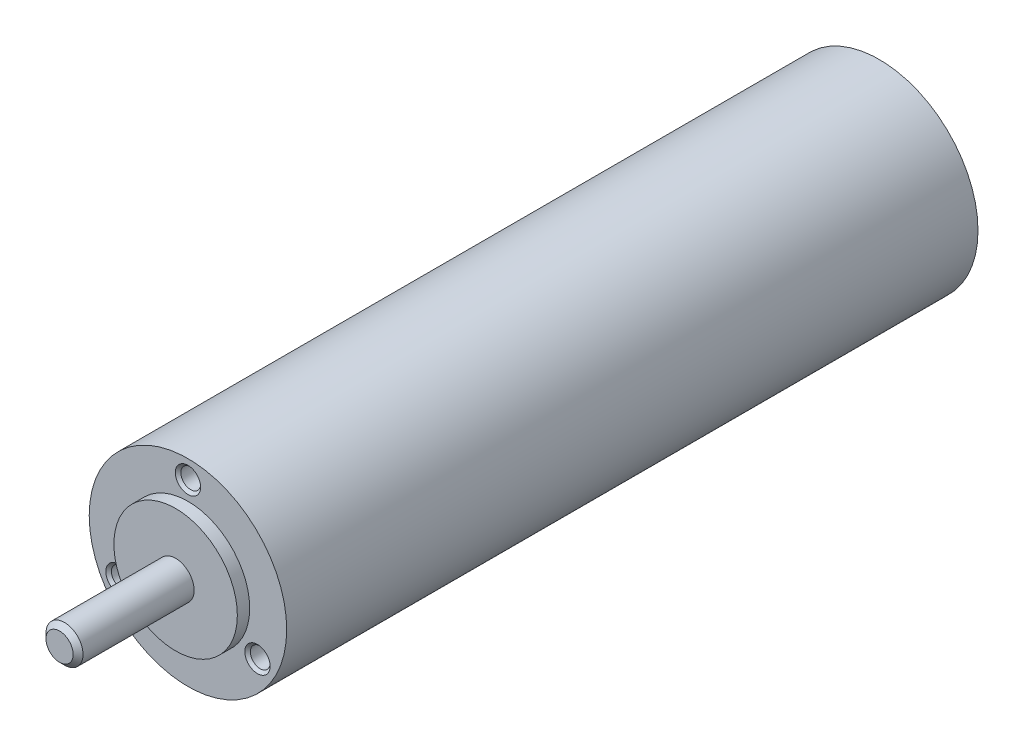
ISO-10303-21;
HEADER;
FILE_DESCRIPTION(('STEP AP214'),'2;1');
FILE_NAME('part.step','',(''),(''),'','','');
FILE_SCHEMA(('AUTOMOTIVE_DESIGN { 1 0 10303 214 1 1 1 1 }'));
ENDSEC;
DATA;
#1=APPLICATION_CONTEXT('core data for automotive mechanical design processes');
#2=APPLICATION_PROTOCOL_DEFINITION('international standard','automotive_design',2000,#1);
#3=PRODUCT_CONTEXT('',#1,'mechanical');
#4=PRODUCT('Part','Part','',(#3));
#5=PRODUCT_RELATED_PRODUCT_CATEGORY('part','',(#4));
#6=PRODUCT_DEFINITION_FORMATION('','',#4);
#7=PRODUCT_DEFINITION_CONTEXT('part definition',#1,'design');
#8=PRODUCT_DEFINITION('design','',#6,#7);
#9=PRODUCT_DEFINITION_SHAPE('','',#8);
#10=(LENGTH_UNIT() NAMED_UNIT(*) SI_UNIT(.MILLI.,.METRE.));
#11=(NAMED_UNIT(*) PLANE_ANGLE_UNIT() SI_UNIT($,.RADIAN.));
#12=(NAMED_UNIT(*) SI_UNIT($,.STERADIAN.) SOLID_ANGLE_UNIT());
#13=UNCERTAINTY_MEASURE_WITH_UNIT(LENGTH_MEASURE(1.E-05),#10,'distance_accuracy_value','');
#14=(GEOMETRIC_REPRESENTATION_CONTEXT(3) GLOBAL_UNCERTAINTY_ASSIGNED_CONTEXT((#13)) GLOBAL_UNIT_ASSIGNED_CONTEXT((#10,
#11,#12)) REPRESENTATION_CONTEXT('',''));
#15=CARTESIAN_POINT('',(0.,0.,0.));
#16=DIRECTION('',(0.,0.,1.));
#17=DIRECTION('',(1.,0.,0.));
#18=AXIS2_PLACEMENT_3D('',#15,#16,#17);
#19=CARTESIAN_POINT('',(0.,0.,0.));
#20=DIRECTION('',(0.,0.,1.));
#21=DIRECTION('',(1.,0.,0.));
#22=AXIS2_PLACEMENT_3D('',#19,#20,#21);
#23=PLANE('',#22);
#24=CARTESIAN_POINT('',(0.,0.,0.));
#25=DIRECTION('',(0.,0.,1.));
#26=DIRECTION('',(1.,0.,0.));
#27=AXIS2_PLACEMENT_3D('',#24,#25,#26);
#28=CIRCLE('',#27,1.10000000000002);
#29=CARTESIAN_POINT('',(1.10000000000002,0.,0.));
#30=VERTEX_POINT('',#29);
#31=EDGE_CURVE('E51',#30,#30,#28,.T.);
#32=ORIENTED_EDGE('',*,*,#31,.T.);
#33=EDGE_LOOP('',(#32));
#34=FACE_BOUND('',#33,.T.);
#35=ADVANCED_FACE('F43',(#34),#23,.T.);
#36=CARTESIAN_POINT('',(0.,0.,0.));
#37=DIRECTION('',(0.,0.,1.));
#38=DIRECTION('',(1.,0.,0.));
#39=AXIS2_PLACEMENT_3D('',#36,#37,#38);
#40=CYLINDRICAL_SURFACE('',#39,1.5);
#41=CARTESIAN_POINT('',(0.,0.,-0.399999999999975));
#42=DIRECTION('',(0.,0.,1.));
#43=DIRECTION('',(1.,0.,0.));
#44=AXIS2_PLACEMENT_3D('',#41,#42,#43);
#45=CIRCLE('',#44,1.5);
#46=CARTESIAN_POINT('',(1.5,0.,-0.399999999999975));
#47=VERTEX_POINT('',#46);
#48=EDGE_CURVE('E11',#47,#47,#45,.F.);
#49=ORIENTED_EDGE('',*,*,#48,.T.);
#50=EDGE_LOOP('',(#49));
#51=FACE_BOUND('',#50,.T.);
#52=CARTESIAN_POINT('',(0.,0.,-9.4));
#53=DIRECTION('',(0.,0.,1.));
#54=DIRECTION('',(1.,0.,0.));
#55=AXIS2_PLACEMENT_3D('',#52,#53,#54);
#56=CIRCLE('',#55,1.5);
#57=CARTESIAN_POINT('',(1.5,0.,-9.4));
#58=VERTEX_POINT('',#57);
#59=EDGE_CURVE('E108',#58,#58,#56,.T.);
#60=ORIENTED_EDGE('',*,*,#59,.T.);
#61=EDGE_LOOP('',(#60));
#62=FACE_BOUND('',#61,.T.);
#63=ADVANCED_FACE('F129',(#51,#62),#40,.T.);
#64=CARTESIAN_POINT('',(0.,-1.5,-9.4));
#65=DIRECTION('',(0.,0.,1.));
#66=DIRECTION('',(1.,0.,0.));
#67=AXIS2_PLACEMENT_3D('',#64,#65,#66);
#68=PLANE('',#67);
#69=CARTESIAN_POINT('',(0.,0.,-9.4));
#70=DIRECTION('',(0.,0.,1.));
#71=DIRECTION('',(1.,0.,0.));
#72=AXIS2_PLACEMENT_3D('',#69,#70,#71);
#73=CIRCLE('',#72,5.);
#74=CARTESIAN_POINT('',(5.,0.,-9.4));
#75=VERTEX_POINT('',#74);
#76=EDGE_CURVE('E105',#75,#75,#73,.T.);
#77=ORIENTED_EDGE('',*,*,#76,.T.);
#78=EDGE_LOOP('',(#77));
#79=FACE_BOUND('',#78,.T.);
#80=ORIENTED_EDGE('',*,*,#59,.F.);
#81=EDGE_LOOP('',(#80));
#82=FACE_BOUND('',#81,.T.);
#83=ADVANCED_FACE('F133',(#79,#82),#68,.T.);
#84=CARTESIAN_POINT('',(0.,0.,0.));
#85=DIRECTION('',(0.,0.,1.));
#86=DIRECTION('',(1.,0.,0.));
#87=AXIS2_PLACEMENT_3D('',#84,#85,#86);
#88=CYLINDRICAL_SURFACE('',#87,5.);
#89=CARTESIAN_POINT('',(0.,0.,-10.4));
#90=DIRECTION('',(0.,0.,1.));
#91=DIRECTION('',(1.,0.,0.));
#92=AXIS2_PLACEMENT_3D('',#89,#90,#91);
#93=CIRCLE('',#92,5.);
#94=CARTESIAN_POINT('',(5.,0.,-10.4));
#95=VERTEX_POINT('',#94);
#96=EDGE_CURVE('E102',#95,#95,#93,.T.);
#97=ORIENTED_EDGE('',*,*,#96,.T.);
#98=EDGE_LOOP('',(#97));
#99=FACE_BOUND('',#98,.T.);
#100=ORIENTED_EDGE('',*,*,#76,.F.);
#101=EDGE_LOOP('',(#100));
#102=FACE_BOUND('',#101,.T.);
#103=ADVANCED_FACE('F139',(#99,#102),#88,.T.);
#104=CARTESIAN_POINT('',(0.,-5.,-10.4));
#105=DIRECTION('',(0.,0.,1.));
#106=DIRECTION('',(1.,0.,0.));
#107=AXIS2_PLACEMENT_3D('',#104,#105,#106);
#108=PLANE('',#107);
#109=CARTESIAN_POINT('',(5.62916512459888,-3.24999999999995,-10.4));
#110=DIRECTION('',(0.,0.,1.));
#111=DIRECTION('',(1.,0.,0.));
#112=AXIS2_PLACEMENT_3D('',#109,#110,#111);
#113=CIRCLE('',#112,1.025);
#114=CARTESIAN_POINT('',(6.65416512459888,-3.24999999999995,-10.4));
#115=VERTEX_POINT('',#114);
#116=EDGE_CURVE('E78',#115,#115,#113,.T.);
#117=ORIENTED_EDGE('',*,*,#116,.F.);
#118=EDGE_LOOP('',(#117));
#119=FACE_BOUND('',#118,.T.);
#120=CARTESIAN_POINT('',(-5.62916512459884,-3.25000000000003,-10.4));
#121=DIRECTION('',(0.,0.,1.));
#122=DIRECTION('',(1.,0.,0.));
#123=AXIS2_PLACEMENT_3D('',#120,#121,#122);
#124=CIRCLE('',#123,1.025);
#125=CARTESIAN_POINT('',(-4.60416512459884,-3.25000000000003,-10.4));
#126=VERTEX_POINT('',#125);
#127=EDGE_CURVE('E71',#126,#126,#124,.T.);
#128=ORIENTED_EDGE('',*,*,#127,.F.);
#129=EDGE_LOOP('',(#128));
#130=FACE_BOUND('',#129,.T.);
#131=CARTESIAN_POINT('',(0.,6.5,-10.4));
#132=DIRECTION('',(0.,0.,1.));
#133=DIRECTION('',(1.,0.,0.));
#134=AXIS2_PLACEMENT_3D('',#131,#132,#133);
#135=CIRCLE('',#134,1.025);
#136=CARTESIAN_POINT('',(1.025,6.5,-10.4));
#137=VERTEX_POINT('',#136);
#138=EDGE_CURVE('E87',#137,#137,#135,.T.);
#139=ORIENTED_EDGE('',*,*,#138,.F.);
#140=EDGE_LOOP('',(#139));
#141=FACE_BOUND('',#140,.T.);
#142=CARTESIAN_POINT('',(0.,0.,-10.4));
#143=DIRECTION('',(0.,0.,1.));
#144=DIRECTION('',(1.,0.,0.));
#145=AXIS2_PLACEMENT_3D('',#142,#143,#144);
#146=CIRCLE('',#145,8.);
#147=CARTESIAN_POINT('',(8.,0.,-10.4));
#148=VERTEX_POINT('',#147);
#149=EDGE_CURVE('E99',#148,#148,#146,.T.);
#150=ORIENTED_EDGE('',*,*,#149,.T.);
#151=EDGE_LOOP('',(#150));
#152=FACE_BOUND('',#151,.T.);
#153=ORIENTED_EDGE('',*,*,#96,.F.);
#154=EDGE_LOOP('',(#153));
#155=FACE_BOUND('',#154,.T.);
#156=ADVANCED_FACE('F143',(#119,#130,#141,#152,#155),#108,.T.);
#157=CARTESIAN_POINT('',(0.,0.,0.));
#158=DIRECTION('',(0.,0.,1.));
#159=DIRECTION('',(1.,0.,0.));
#160=AXIS2_PLACEMENT_3D('',#157,#158,#159);
#161=CYLINDRICAL_SURFACE('',#160,8.);
#162=CARTESIAN_POINT('',(0.,0.,-66.4));
#163=DIRECTION('',(0.,0.,1.));
#164=DIRECTION('',(1.,0.,0.));
#165=AXIS2_PLACEMENT_3D('',#162,#163,#164);
#166=CIRCLE('',#165,8.);
#167=CARTESIAN_POINT('',(8.,0.,-66.4));
#168=VERTEX_POINT('',#167);
#169=EDGE_CURVE('E96',#168,#168,#166,.T.);
#170=ORIENTED_EDGE('',*,*,#169,.T.);
#171=EDGE_LOOP('',(#170));
#172=FACE_BOUND('',#171,.T.);
#173=ORIENTED_EDGE('',*,*,#149,.F.);
#174=EDGE_LOOP('',(#173));
#175=FACE_BOUND('',#174,.T.);
#176=ADVANCED_FACE('F124',(#172,#175),#161,.T.);
#177=CARTESIAN_POINT('',(0.,-8.,-66.4));
#178=DIRECTION('',(0.,0.,-1.));
#179=DIRECTION('',(-1.,0.,0.));
#180=AXIS2_PLACEMENT_3D('',#177,#178,#179);
#181=PLANE('',#180);
#182=ORIENTED_EDGE('',*,*,#169,.F.);
#183=EDGE_LOOP('',(#182));
#184=FACE_BOUND('',#183,.T.);
#185=ADVANCED_FACE('F116',(#184),#181,.T.);
#186=CARTESIAN_POINT('',(0.,0.,0.));
#187=DIRECTION('',(0.,0.,-1.));
#188=DIRECTION('',(-1.,0.,0.));
#189=AXIS2_PLACEMENT_3D('',#186,#187,#188);
#190=CONICAL_SURFACE('',#189,1.10000000000002,0.785398163397457);
#191=ORIENTED_EDGE('',*,*,#48,.F.);
#192=EDGE_LOOP('',(#191));
#193=FACE_BOUND('',#192,.T.);
#194=ORIENTED_EDGE('',*,*,#31,.F.);
#195=EDGE_LOOP('',(#194));
#196=FACE_BOUND('',#195,.T.);
#197=ADVANCED_FACE('F45',(#193,#196),#190,.T.);
#198=CARTESIAN_POINT('',(0.,6.5,-14.4));
#199=DIRECTION('',(0.,0.,1.));
#200=DIRECTION('',(1.,0.,0.));
#201=AXIS2_PLACEMENT_3D('',#198,#199,#200);
#202=CONICAL_SURFACE('',#201,0.799999999999999,1.02974425867665);
#203=CARTESIAN_POINT('',(0.,6.5,-14.880688495222));
#204=VERTEX_POINT('',#203);
#205=VERTEX_LOOP('',#204);
#206=FACE_BOUND('',#205,.T.);
#207=CARTESIAN_POINT('',(0.,6.5,-14.4));
#208=DIRECTION('',(0.,0.,1.));
#209=DIRECTION('',(1.,0.,0.));
#210=AXIS2_PLACEMENT_3D('',#207,#208,#209);
#211=CIRCLE('',#210,0.799999999999999);
#212=CARTESIAN_POINT('',(0.799999999999999,6.5,-14.4));
#213=VERTEX_POINT('',#212);
#214=EDGE_CURVE('E93',#213,#213,#211,.T.);
#215=ORIENTED_EDGE('',*,*,#214,.T.);
#216=EDGE_LOOP('',(#215));
#217=FACE_BOUND('',#216,.T.);
#218=ADVANCED_FACE('F115',(#206,#217),#202,.F.);
#219=CARTESIAN_POINT('',(0.,6.5,-10.4));
#220=DIRECTION('',(0.,0.,1.));
#221=DIRECTION('',(1.,0.,0.));
#222=AXIS2_PLACEMENT_3D('',#219,#220,#221);
#223=CYLINDRICAL_SURFACE('',#222,0.799999999999999);
#224=ORIENTED_EDGE('',*,*,#214,.F.);
#225=EDGE_LOOP('',(#224));
#226=FACE_BOUND('',#225,.T.);
#227=CARTESIAN_POINT('',(0.,6.5,-10.625));
#228=DIRECTION('',(0.,0.,1.));
#229=DIRECTION('',(1.,0.,0.));
#230=AXIS2_PLACEMENT_3D('',#227,#228,#229);
#231=CIRCLE('',#230,0.799999999999999);
#232=CARTESIAN_POINT('',(0.799999999999999,6.5,-10.625));
#233=VERTEX_POINT('',#232);
#234=EDGE_CURVE('E90',#233,#233,#231,.T.);
#235=ORIENTED_EDGE('',*,*,#234,.T.);
#236=EDGE_LOOP('',(#235));
#237=FACE_BOUND('',#236,.T.);
#238=ADVANCED_FACE('F122',(#226,#237),#223,.F.);
#239=CARTESIAN_POINT('',(0.,6.5,-10.4));
#240=DIRECTION('',(0.,0.,1.));
#241=DIRECTION('',(1.,0.,0.));
#242=AXIS2_PLACEMENT_3D('',#239,#240,#241);
#243=CONICAL_SURFACE('',#242,1.025,0.785398163397447);
#244=ORIENTED_EDGE('',*,*,#234,.F.);
#245=EDGE_LOOP('',(#244));
#246=FACE_BOUND('',#245,.T.);
#247=ORIENTED_EDGE('',*,*,#138,.T.);
#248=EDGE_LOOP('',(#247));
#249=FACE_BOUND('',#248,.T.);
#250=ADVANCED_FACE('F153',(#246,#249),#243,.F.);
#251=CARTESIAN_POINT('',(-5.62916512459884,-3.25000000000003,-14.4));
#252=DIRECTION('',(0.,0.,1.));
#253=DIRECTION('',(1.,0.,0.));
#254=AXIS2_PLACEMENT_3D('',#251,#252,#253);
#255=CONICAL_SURFACE('',#254,0.799999999999999,1.02974425867665);
#256=CARTESIAN_POINT('',(-5.62916512459884,-3.25000000000003,-14.880688495222));
#257=VERTEX_POINT('',#256);
#258=VERTEX_LOOP('',#257);
#259=FACE_BOUND('',#258,.T.);
#260=CARTESIAN_POINT('',(-5.62916512459884,-3.25000000000003,-14.4));
#261=DIRECTION('',(0.,0.,1.));
#262=DIRECTION('',(1.,0.,0.));
#263=AXIS2_PLACEMENT_3D('',#260,#261,#262);
#264=CIRCLE('',#263,0.799999999999999);
#265=CARTESIAN_POINT('',(-4.82916512459884,-3.25000000000003,-14.4));
#266=VERTEX_POINT('',#265);
#267=EDGE_CURVE('E84',#266,#266,#264,.T.);
#268=ORIENTED_EDGE('',*,*,#267,.T.);
#269=EDGE_LOOP('',(#268));
#270=FACE_BOUND('',#269,.T.);
#271=ADVANCED_FACE('F157',(#259,#270),#255,.F.);
#272=CARTESIAN_POINT('',(-5.62916512459884,-3.25000000000003,-10.4));
#273=DIRECTION('',(0.,0.,1.));
#274=DIRECTION('',(1.,0.,0.));
#275=AXIS2_PLACEMENT_3D('',#272,#273,#274);
#276=CYLINDRICAL_SURFACE('',#275,0.799999999999999);
#277=ORIENTED_EDGE('',*,*,#267,.F.);
#278=EDGE_LOOP('',(#277));
#279=FACE_BOUND('',#278,.T.);
#280=CARTESIAN_POINT('',(-5.62916512459884,-3.25000000000003,-10.625));
#281=DIRECTION('',(0.,0.,1.));
#282=DIRECTION('',(1.,0.,0.));
#283=AXIS2_PLACEMENT_3D('',#280,#281,#282);
#284=CIRCLE('',#283,0.799999999999999);
#285=CARTESIAN_POINT('',(-4.82916512459884,-3.25000000000003,-10.625));
#286=VERTEX_POINT('',#285);
#287=EDGE_CURVE('E75',#286,#286,#284,.T.);
#288=ORIENTED_EDGE('',*,*,#287,.T.);
#289=EDGE_LOOP('',(#288));
#290=FACE_BOUND('',#289,.T.);
#291=ADVANCED_FACE('F161',(#279,#290),#276,.F.);
#292=CARTESIAN_POINT('',(-5.62916512459884,-3.25000000000003,-10.4));
#293=DIRECTION('',(0.,0.,1.));
#294=DIRECTION('',(1.,0.,0.));
#295=AXIS2_PLACEMENT_3D('',#292,#293,#294);
#296=CONICAL_SURFACE('',#295,1.025,0.785398163397446);
#297=ORIENTED_EDGE('',*,*,#287,.F.);
#298=EDGE_LOOP('',(#297));
#299=FACE_BOUND('',#298,.T.);
#300=ORIENTED_EDGE('',*,*,#127,.T.);
#301=EDGE_LOOP('',(#300));
#302=FACE_BOUND('',#301,.T.);
#303=ADVANCED_FACE('F65',(#299,#302),#296,.F.);
#304=CARTESIAN_POINT('',(5.62916512459888,-3.24999999999995,-14.4));
#305=DIRECTION('',(0.,0.,1.));
#306=DIRECTION('',(1.,0.,0.));
#307=AXIS2_PLACEMENT_3D('',#304,#305,#306);
#308=CONICAL_SURFACE('',#307,0.799999999999999,1.02974425867665);
#309=CARTESIAN_POINT('',(5.62916512459888,-3.24999999999995,-14.880688495222));
#310=VERTEX_POINT('',#309);
#311=VERTEX_LOOP('',#310);
#312=FACE_BOUND('',#311,.T.);
#313=CARTESIAN_POINT('',(5.62916512459888,-3.24999999999995,-14.4));
#314=DIRECTION('',(0.,0.,1.));
#315=DIRECTION('',(1.,0.,0.));
#316=AXIS2_PLACEMENT_3D('',#313,#314,#315);
#317=CIRCLE('',#316,0.799999999999999);
#318=CARTESIAN_POINT('',(6.42916512459888,-3.24999999999995,-14.4));
#319=VERTEX_POINT('',#318);
#320=EDGE_CURVE('E69',#319,#319,#317,.T.);
#321=ORIENTED_EDGE('',*,*,#320,.T.);
#322=EDGE_LOOP('',(#321));
#323=FACE_BOUND('',#322,.T.);
#324=ADVANCED_FACE('F61',(#312,#323),#308,.F.);
#325=CARTESIAN_POINT('',(5.62916512459888,-3.24999999999995,-10.4));
#326=DIRECTION('',(0.,0.,1.));
#327=DIRECTION('',(1.,0.,0.));
#328=AXIS2_PLACEMENT_3D('',#325,#326,#327);
#329=CYLINDRICAL_SURFACE('',#328,0.799999999999999);
#330=ORIENTED_EDGE('',*,*,#320,.F.);
#331=EDGE_LOOP('',(#330));
#332=FACE_BOUND('',#331,.T.);
#333=CARTESIAN_POINT('',(5.62916512459888,-3.24999999999995,-10.625));
#334=DIRECTION('',(0.,0.,1.));
#335=DIRECTION('',(1.,0.,0.));
#336=AXIS2_PLACEMENT_3D('',#333,#334,#335);
#337=CIRCLE('',#336,0.799999999999999);
#338=CARTESIAN_POINT('',(6.42916512459888,-3.24999999999995,-10.625));
#339=VERTEX_POINT('',#338);
#340=EDGE_CURVE('E72',#339,#339,#337,.T.);
#341=ORIENTED_EDGE('',*,*,#340,.T.);
#342=EDGE_LOOP('',(#341));
#343=FACE_BOUND('',#342,.T.);
#344=ADVANCED_FACE('F64',(#332,#343),#329,.F.);
#345=CARTESIAN_POINT('',(5.62916512459888,-3.24999999999995,-10.4));
#346=DIRECTION('',(0.,0.,1.));
#347=DIRECTION('',(1.,0.,0.));
#348=AXIS2_PLACEMENT_3D('',#345,#346,#347);
#349=CONICAL_SURFACE('',#348,1.025,0.785398163397446);
#350=ORIENTED_EDGE('',*,*,#340,.F.);
#351=EDGE_LOOP('',(#350));
#352=FACE_BOUND('',#351,.T.);
#353=ORIENTED_EDGE('',*,*,#116,.T.);
#354=EDGE_LOOP('',(#353));
#355=FACE_BOUND('',#354,.T.);
#356=ADVANCED_FACE('F170',(#352,#355),#349,.F.);
#357=CLOSED_SHELL('',(#35,#63,#83,#103,#156,#176,#185,#197,#218,#238,#250,#271,#291,#303,#324,
#344,#356));
#358=MANIFOLD_SOLID_BREP('B2',#357);
#359=ADVANCED_BREP_SHAPE_REPRESENTATION('',(#18,#358),#14);
#360=SHAPE_DEFINITION_REPRESENTATION(#9,#359);
ENDSEC;
END-ISO-10303-21;
